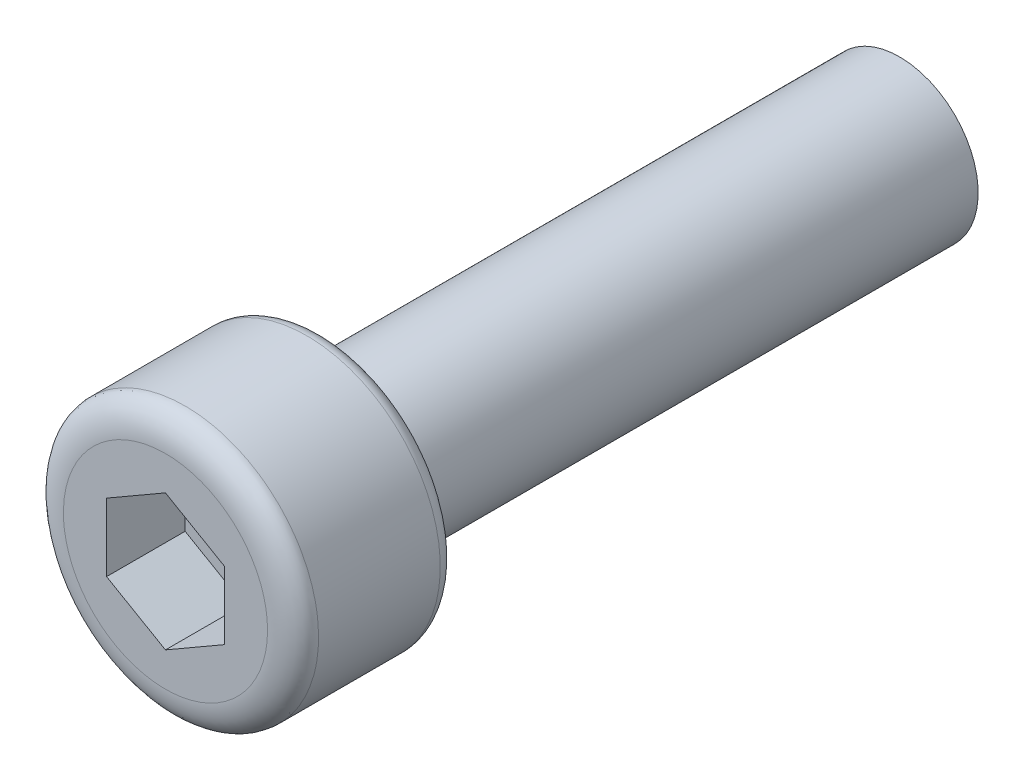
ISO-10303-21;
HEADER;
FILE_DESCRIPTION(('STEP AP214'),'2;1');
FILE_NAME('part.step','',(''),(''),'','','');
FILE_SCHEMA(('AUTOMOTIVE_DESIGN { 1 0 10303 214 1 1 1 1 }'));
ENDSEC;
DATA;
#1=APPLICATION_CONTEXT('core data for automotive mechanical design processes');
#2=APPLICATION_PROTOCOL_DEFINITION('international standard','automotive_design',2000,#1);
#3=PRODUCT_CONTEXT('',#1,'mechanical');
#4=PRODUCT('Part','Part','',(#3));
#5=PRODUCT_RELATED_PRODUCT_CATEGORY('part','',(#4));
#6=PRODUCT_DEFINITION_FORMATION('','',#4);
#7=PRODUCT_DEFINITION_CONTEXT('part definition',#1,'design');
#8=PRODUCT_DEFINITION('design','',#6,#7);
#9=PRODUCT_DEFINITION_SHAPE('','',#8);
#10=(LENGTH_UNIT() NAMED_UNIT(*) SI_UNIT(.MILLI.,.METRE.));
#11=(NAMED_UNIT(*) PLANE_ANGLE_UNIT() SI_UNIT($,.RADIAN.));
#12=(NAMED_UNIT(*) SI_UNIT($,.STERADIAN.) SOLID_ANGLE_UNIT());
#13=UNCERTAINTY_MEASURE_WITH_UNIT(LENGTH_MEASURE(1.E-05),#10,'distance_accuracy_value','');
#14=(GEOMETRIC_REPRESENTATION_CONTEXT(3) GLOBAL_UNCERTAINTY_ASSIGNED_CONTEXT((#13)) GLOBAL_UNIT_ASSIGNED_CONTEXT((#10,
#11,#12)) REPRESENTATION_CONTEXT('',''));
#15=CARTESIAN_POINT('',(0.,0.,0.));
#16=DIRECTION('',(0.,0.,1.));
#17=DIRECTION('',(1.,0.,0.));
#18=AXIS2_PLACEMENT_3D('',#15,#16,#17);
#19=CARTESIAN_POINT('',(0.,0.,9.5));
#20=DIRECTION('',(0.,0.,1.));
#21=DIRECTION('',(1.,0.,0.));
#22=AXIS2_PLACEMENT_3D('',#19,#20,#21);
#23=PLANE('',#22);
#24=DIRECTION('',(-0.866025403784439,0.5,0.));
#25=VECTOR('',#24,1.);
#26=CARTESIAN_POINT('',(1.5,0.86602540378444,9.5));
#27=LINE('',#26,#25);
#28=CARTESIAN_POINT('',(1.5,0.86602540378444,9.5));
#29=VERTEX_POINT('',#28);
#30=CARTESIAN_POINT('',(0.,1.73205080756888,9.5));
#31=VERTEX_POINT('',#30);
#32=EDGE_CURVE('E58',#29,#31,#27,.T.);
#33=ORIENTED_EDGE('',*,*,#32,.F.);
#34=DIRECTION('',(0.,1.,0.));
#35=VECTOR('',#34,1.);
#36=CARTESIAN_POINT('',(1.5,-0.866025403784439,9.5));
#37=LINE('',#36,#35);
#38=CARTESIAN_POINT('',(1.5,-0.866025403784439,9.5));
#39=VERTEX_POINT('',#38);
#40=EDGE_CURVE('E141',#39,#29,#37,.T.);
#41=ORIENTED_EDGE('',*,*,#40,.F.);
#42=DIRECTION('',(0.866025403784439,0.5,0.));
#43=VECTOR('',#42,1.);
#44=CARTESIAN_POINT('',(0.,-1.73205080756888,9.5));
#45=LINE('',#44,#43);
#46=CARTESIAN_POINT('',(0.,-1.73205080756888,9.5));
#47=VERTEX_POINT('',#46);
#48=EDGE_CURVE('E139',#47,#39,#45,.T.);
#49=ORIENTED_EDGE('',*,*,#48,.F.);
#50=DIRECTION('',(0.866025403784438,-0.5,0.));
#51=VECTOR('',#50,1.);
#52=CARTESIAN_POINT('',(-1.5,-0.866025403784438,9.5));
#53=LINE('',#52,#51);
#54=CARTESIAN_POINT('',(-1.5,-0.866025403784438,9.5));
#55=VERTEX_POINT('',#54);
#56=EDGE_CURVE('E106',#55,#47,#53,.T.);
#57=ORIENTED_EDGE('',*,*,#56,.F.);
#58=DIRECTION('',(0.,-1.,0.));
#59=VECTOR('',#58,1.);
#60=CARTESIAN_POINT('',(-1.5,0.866025403784439,9.5));
#61=LINE('',#60,#59);
#62=CARTESIAN_POINT('',(-1.5,0.866025403784439,9.5));
#63=VERTEX_POINT('',#62);
#64=EDGE_CURVE('E135',#63,#55,#61,.T.);
#65=ORIENTED_EDGE('',*,*,#64,.F.);
#66=DIRECTION('',(-0.866025403784439,-0.5,0.));
#67=VECTOR('',#66,1.);
#68=CARTESIAN_POINT('',(0.,1.73205080756888,9.5));
#69=LINE('',#68,#67);
#70=EDGE_CURVE('E132',#31,#63,#69,.T.);
#71=ORIENTED_EDGE('',*,*,#70,.F.);
#72=EDGE_LOOP('',(#33,#41,#49,#57,#65,#71));
#73=FACE_BOUND('',#72,.T.);
#74=CARTESIAN_POINT('',(-2.6,0.,9.5));
#75=CARTESIAN_POINT('',(-2.6,0.340339195747886,9.5));
#76=CARTESIAN_POINT('',(-2.53232895612653,0.680544507086418,9.5));
#77=CARTESIAN_POINT('',(-2.27184461293216,1.30940934121205,9.5));
#78=CARTESIAN_POINT('',(-2.07913378430198,1.59782147786811,9.5));
#79=CARTESIAN_POINT('',(-1.59782147786807,2.07913378430194,9.5));
#80=CARTESIAN_POINT('',(-1.30940934121205,2.27184461293216,9.5));
#81=CARTESIAN_POINT('',(-0.680544507086415,2.53232895612653,9.5));
#82=CARTESIAN_POINT('',(-0.340339195747888,2.6,9.5));
#83=CARTESIAN_POINT('',(0.340339195747889,2.6,9.5));
#84=CARTESIAN_POINT('',(0.680544507086413,2.53232895612653,9.5));
#85=CARTESIAN_POINT('',(1.30940934121205,2.27184461293216,9.5));
#86=CARTESIAN_POINT('',(1.59782147786806,2.07913378430191,9.5));
#87=CARTESIAN_POINT('',(2.07913378430199,1.59782147786813,9.5));
#88=CARTESIAN_POINT('',(2.27184461293214,1.30940934121206,9.5));
#89=CARTESIAN_POINT('',(2.53232895612655,0.680544507086403,9.5));
#90=CARTESIAN_POINT('',(2.6,0.340339195748112,9.5));
#91=CARTESIAN_POINT('',(2.6,-0.340339195748117,9.5));
#92=CARTESIAN_POINT('',(2.53232895612663,-0.680544507086149,9.5));
#93=CARTESIAN_POINT('',(2.27184461293207,-1.30940934121232,9.5));
#94=CARTESIAN_POINT('',(2.07913378430184,-1.59782147786829,9.5));
#95=CARTESIAN_POINT('',(1.59782147786821,-2.07913378430176,9.5));
#96=CARTESIAN_POINT('',(1.30940934121224,-2.27184461293209,9.5));
#97=CARTESIAN_POINT('',(0.68054450708623,-2.53232895612661,9.5));
#98=CARTESIAN_POINT('',(0.340339195748087,-2.6,9.5));
#99=CARTESIAN_POINT('',(-0.340339195748083,-2.6,9.5));
#100=CARTESIAN_POINT('',(-0.680544507086233,-2.53232895612661,9.5));
#101=CARTESIAN_POINT('',(-1.30940934121224,-2.27184461293209,9.5));
#102=CARTESIAN_POINT('',(-1.59782147786814,-2.07913378430198,9.5));
#103=CARTESIAN_POINT('',(-2.0791337843019,-1.59782147786808,9.5));
#104=CARTESIAN_POINT('',(-2.27184461293223,-1.30940934121205,9.5));
#105=CARTESIAN_POINT('',(-2.53232895612646,-0.680544507086416,9.5));
#106=CARTESIAN_POINT('',(-2.6,-0.34033919574789,9.5));
#107=CARTESIAN_POINT('',(-2.6,0.,9.5));
#108=(BOUNDED_CURVE() B_SPLINE_CURVE(3,(#74,#75,#76,#77,#78,#79,#80,#81,#82,#83,#84,#85,#86,#87,
#88,#89,#90,#91,#92,#93,#94,#95,#96,#97,#98,#99,#100,#101,#102,#103,#104,#105,#106,#107),
.UNSPECIFIED.,.T.,.F.) B_SPLINE_CURVE_WITH_KNOTS((4,2,2,2,2,2,2,2,2,2,2,2,2,2,2,2,4),
(-3.14159265358979,-2.74889357189107,-2.35619449019234,-1.96349540849362,-1.5707963267949,
-1.17809724509617,-0.785398163397448,-0.392699081698724,0.,0.392699081698724,0.785398163397448,
1.17809724509617,1.5707963267949,1.96349540849362,2.35619449019234,2.74889357189107,
3.14159265358979),
.UNSPECIFIED.) CURVE() GEOMETRIC_REPRESENTATION_ITEM() RATIONAL_B_SPLINE_CURVE((1.,1.,1.,1.,1.,
1.,1.,1.,1.,1.,1.,1.,1.,1.,1.,1.,1.,1.,1.,1.,1.,1.,1.,1.,1.,1.,1.,1.,1.,1.,1.,1.,1.,1.)) REPRESENTATION_ITEM(''));
#109=CARTESIAN_POINT('',(-2.6,0.,9.5));
#110=VERTEX_POINT('',#109);
#111=EDGE_CURVE('E12',#110,#110,#108,.F.);
#112=ORIENTED_EDGE('',*,*,#111,.T.);
#113=EDGE_LOOP('',(#112));
#114=FACE_BOUND('',#113,.T.);
#115=ADVANCED_FACE('F37',(#73,#114),#23,.T.);
#116=CARTESIAN_POINT('',(0.,0.,-9.5));
#117=DIRECTION('',(0.,0.,-1.));
#118=DIRECTION('',(-1.,0.,0.));
#119=AXIS2_PLACEMENT_3D('',#116,#117,#118);
#120=CYLINDRICAL_SURFACE('',#119,3.4);
#121=CARTESIAN_POINT('',(-3.4,0.,9.));
#122=CARTESIAN_POINT('',(-3.4,-0.445058948285702,9.));
#123=CARTESIAN_POINT('',(-3.31150709647312,-0.889942816959202,9.));
#124=CARTESIAN_POINT('',(-2.97087372460363,-1.7123045231234,9.));
#125=CARTESIAN_POINT('',(-2.71886725639482,-2.08945885567371,9.));
#126=CARTESIAN_POINT('',(-2.0894588556737,-2.71886725639483,9.));
#127=CARTESIAN_POINT('',(-1.71230452312369,-2.97087372460351,9.));
#128=CARTESIAN_POINT('',(-0.889942816958928,-3.31150709647324,9.));
#129=CARTESIAN_POINT('',(-0.445058948285955,-3.4,9.));
#130=CARTESIAN_POINT('',(0.445058948285959,-3.4,9.));
#131=CARTESIAN_POINT('',(0.889942816958924,-3.31150709647324,9.));
#132=CARTESIAN_POINT('',(1.71230452312369,-2.97087372460352,9.));
#133=CARTESIAN_POINT('',(2.08945885567385,-2.71886725639468,9.));
#134=CARTESIAN_POINT('',(2.71886725639468,-2.08945885567385,9.));
#135=CARTESIAN_POINT('',(2.97087372460348,-1.71230452312378,9.));
#136=CARTESIAN_POINT('',(3.31150709647328,-0.889942816958834,9.));
#137=CARTESIAN_POINT('',(3.4,-0.445058948285998,9.));
#138=CARTESIAN_POINT('',(3.4,0.445058948285993,9.));
#139=CARTESIAN_POINT('',(3.31150709647316,0.889942816959108,9.));
#140=CARTESIAN_POINT('',(2.97087372460359,1.7123045231235,9.));
#141=CARTESIAN_POINT('',(2.71886725639486,2.08945885567366,9.));
#142=CARTESIAN_POINT('',(2.08945885567366,2.71886725639486,9.));
#143=CARTESIAN_POINT('',(1.71230452312347,2.9708737246036,9.));
#144=CARTESIAN_POINT('',(0.889942816959137,3.31150709647315,9.));
#145=CARTESIAN_POINT('',(0.4450589482857,3.4,9.));
#146=CARTESIAN_POINT('',(-0.4450589482857,3.4,9.));
#147=CARTESIAN_POINT('',(-0.889942816959166,3.31150709647314,9.));
#148=CARTESIAN_POINT('',(-1.71230452312345,2.97087372460361,9.));
#149=CARTESIAN_POINT('',(-2.08945885567367,2.71886725639485,9.));
#150=CARTESIAN_POINT('',(-2.71886725639486,2.08945885567366,9.));
#151=CARTESIAN_POINT('',(-2.9708737246036,1.71230452312347,9.));
#152=CARTESIAN_POINT('',(-3.31150709647314,0.88994281695915,9.));
#153=CARTESIAN_POINT('',(-3.4,0.445058948285698,9.));
#154=CARTESIAN_POINT('',(-3.4,0.,9.));
#155=(BOUNDED_CURVE() B_SPLINE_CURVE(3,(#121,#122,#123,#124,#125,#126,#127,#128,#129,#130,#131,
#132,#133,#134,#135,#136,#137,#138,#139,#140,#141,#142,#143,#144,#145,#146,#147,#148,#149,#150,
#151,#152,#153,#154),.UNSPECIFIED.,.T.,.F.) B_SPLINE_CURVE_WITH_KNOTS((4,2,2,2,2,2,2,2,2,2,2,2,
2,2,2,2,4),(-3.14159265358979,-2.74889357189107,-2.35619449019234,-1.96349540849362,
-1.5707963267949,-1.17809724509617,-0.785398163397448,-0.392699081698724,0.,0.392699081698724,
0.785398163397448,1.17809724509617,1.5707963267949,1.96349540849362,2.35619449019234,
2.74889357189107,3.14159265358979),
.UNSPECIFIED.) CURVE() GEOMETRIC_REPRESENTATION_ITEM() RATIONAL_B_SPLINE_CURVE((1.,1.,1.,1.,1.,
1.,1.,1.,1.,1.,1.,1.,1.,1.,1.,1.,1.,1.,1.,1.,1.,1.,1.,1.,1.,1.,1.,1.,1.,1.,1.,1.,1.,1.)) REPRESENTATION_ITEM(''));
#156=CARTESIAN_POINT('',(-3.4,0.,9.));
#157=VERTEX_POINT('',#156);
#158=EDGE_CURVE('E51',#157,#157,#155,.F.);
#159=ORIENTED_EDGE('',*,*,#158,.T.);
#160=EDGE_LOOP('',(#159));
#161=FACE_BOUND('',#160,.T.);
#162=CARTESIAN_POINT('',(0.,0.,5.9));
#163=DIRECTION('',(0.,0.,-1.));
#164=DIRECTION('',(-1.,0.,0.));
#165=AXIS2_PLACEMENT_3D('',#162,#163,#164);
#166=CIRCLE('',#165,3.4);
#167=CARTESIAN_POINT('',(-3.4,0.,5.9));
#168=VERTEX_POINT('',#167);
#169=EDGE_CURVE('E162',#168,#168,#166,.F.);
#170=ORIENTED_EDGE('',*,*,#169,.T.);
#171=EDGE_LOOP('',(#170));
#172=FACE_BOUND('',#171,.T.);
#173=ADVANCED_FACE('F174',(#161,#172),#120,.T.);
#174=CARTESIAN_POINT('',(0.,3.4,5.5));
#175=DIRECTION('',(0.,0.,-1.));
#176=DIRECTION('',(-1.,0.,0.));
#177=AXIS2_PLACEMENT_3D('',#174,#175,#176);
#178=PLANE('',#177);
#179=CARTESIAN_POINT('',(0.,0.,5.5));
#180=DIRECTION('',(0.,0.,-1.));
#181=DIRECTION('',(-1.,0.,0.));
#182=AXIS2_PLACEMENT_3D('',#179,#180,#181);
#183=CIRCLE('',#182,3.);
#184=CARTESIAN_POINT('',(-3.,0.,5.5));
#185=VERTEX_POINT('',#184);
#186=EDGE_CURVE('E159',#185,#185,#183,.T.);
#187=ORIENTED_EDGE('',*,*,#186,.T.);
#188=EDGE_LOOP('',(#187));
#189=FACE_BOUND('',#188,.T.);
#190=CARTESIAN_POINT('',(0.,0.,5.5));
#191=DIRECTION('',(0.,0.,-1.));
#192=DIRECTION('',(-1.,0.,0.));
#193=AXIS2_PLACEMENT_3D('',#190,#191,#192);
#194=CIRCLE('',#193,2.);
#195=CARTESIAN_POINT('',(-2.,0.,5.5));
#196=VERTEX_POINT('',#195);
#197=EDGE_CURVE('E145',#196,#196,#194,.T.);
#198=ORIENTED_EDGE('',*,*,#197,.F.);
#199=EDGE_LOOP('',(#198));
#200=FACE_BOUND('',#199,.T.);
#201=ADVANCED_FACE('F184',(#189,#200),#178,.T.);
#202=CARTESIAN_POINT('',(0.,0.,-9.5));
#203=DIRECTION('',(0.,0.,-1.));
#204=DIRECTION('',(-1.,0.,0.));
#205=AXIS2_PLACEMENT_3D('',#202,#203,#204);
#206=CYLINDRICAL_SURFACE('',#205,2.);
#207=CARTESIAN_POINT('',(0.,0.,-9.2));
#208=DIRECTION('',(0.,0.,-1.));
#209=DIRECTION('',(-1.,0.,0.));
#210=AXIS2_PLACEMENT_3D('',#207,#208,#209);
#211=CIRCLE('',#210,2.);
#212=CARTESIAN_POINT('',(-2.,0.,-9.2));
#213=VERTEX_POINT('',#212);
#214=EDGE_CURVE('E156',#213,#213,#211,.F.);
#215=ORIENTED_EDGE('',*,*,#214,.T.);
#216=EDGE_LOOP('',(#215));
#217=FACE_BOUND('',#216,.T.);
#218=ORIENTED_EDGE('',*,*,#197,.T.);
#219=EDGE_LOOP('',(#218));
#220=FACE_BOUND('',#219,.T.);
#221=ADVANCED_FACE('F233',(#217,#220),#206,.T.);
#222=CARTESIAN_POINT('',(0.,2.,-9.5));
#223=DIRECTION('',(0.,0.,-1.));
#224=DIRECTION('',(-1.,0.,0.));
#225=AXIS2_PLACEMENT_3D('',#222,#223,#224);
#226=PLANE('',#225);
#227=CARTESIAN_POINT('',(0.,0.,-9.5));
#228=DIRECTION('',(0.,0.,-1.));
#229=DIRECTION('',(-1.,0.,0.));
#230=AXIS2_PLACEMENT_3D('',#227,#228,#229);
#231=CIRCLE('',#230,1.48038475772934);
#232=CARTESIAN_POINT('',(-1.48038475772934,0.,-9.5));
#233=VERTEX_POINT('',#232);
#234=EDGE_CURVE('E153',#233,#233,#231,.T.);
#235=ORIENTED_EDGE('',*,*,#234,.T.);
#236=EDGE_LOOP('',(#235));
#237=FACE_BOUND('',#236,.T.);
#238=ADVANCED_FACE('F225',(#237),#226,.T.);
#239=CARTESIAN_POINT('',(0.,0.,-9.5));
#240=DIRECTION('',(0.,0.,1.));
#241=DIRECTION('',(1.,0.,0.));
#242=AXIS2_PLACEMENT_3D('',#239,#240,#241);
#243=CONICAL_SURFACE('',#242,1.48038475772934,1.0471975511966);
#244=ORIENTED_EDGE('',*,*,#214,.F.);
#245=EDGE_LOOP('',(#244));
#246=FACE_BOUND('',#245,.T.);
#247=ORIENTED_EDGE('',*,*,#234,.F.);
#248=EDGE_LOOP('',(#247));
#249=FACE_BOUND('',#248,.T.);
#250=ADVANCED_FACE('F191',(#246,#249),#243,.T.);
#251=CARTESIAN_POINT('',(0.,0.,5.9));
#252=DIRECTION('',(0.,0.,-1.));
#253=DIRECTION('',(-1.,0.,0.));
#254=AXIS2_PLACEMENT_3D('',#251,#252,#253);
#255=TOROIDAL_SURFACE('',#254,3.,0.4);
#256=ORIENTED_EDGE('',*,*,#169,.F.);
#257=EDGE_LOOP('',(#256));
#258=FACE_BOUND('',#257,.T.);
#259=ORIENTED_EDGE('',*,*,#186,.F.);
#260=EDGE_LOOP('',(#259));
#261=FACE_BOUND('',#260,.T.);
#262=ADVANCED_FACE('F214',(#258,#261),#255,.T.);
#263=CARTESIAN_POINT('',(-2.6,0.,9.5));
#264=CARTESIAN_POINT('',(-2.6,-0.34033919574789,9.5));
#265=CARTESIAN_POINT('',(-2.53232895612646,-0.680544507086416,9.5));
#266=CARTESIAN_POINT('',(-2.27184461293223,-1.30940934121205,9.5));
#267=CARTESIAN_POINT('',(-2.0791337843019,-1.59782147786808,9.5));
#268=CARTESIAN_POINT('',(-1.59782147786814,-2.07913378430198,9.5));
#269=CARTESIAN_POINT('',(-1.30940934121224,-2.27184461293209,9.5));
#270=CARTESIAN_POINT('',(-0.680544507086233,-2.53232895612661,9.5));
#271=CARTESIAN_POINT('',(-0.340339195748083,-2.6,9.5));
#272=CARTESIAN_POINT('',(0.340339195748087,-2.6,9.5));
#273=CARTESIAN_POINT('',(0.68054450708623,-2.53232895612661,9.5));
#274=CARTESIAN_POINT('',(1.30940934121224,-2.27184461293209,9.5));
#275=CARTESIAN_POINT('',(1.59782147786821,-2.07913378430176,9.5));
#276=CARTESIAN_POINT('',(2.07913378430184,-1.59782147786829,9.5));
#277=CARTESIAN_POINT('',(2.27184461293207,-1.30940934121232,9.5));
#278=CARTESIAN_POINT('',(2.53232895612663,-0.680544507086149,9.5));
#279=CARTESIAN_POINT('',(2.6,-0.340339195748117,9.5));
#280=CARTESIAN_POINT('',(2.6,0.340339195748112,9.5));
#281=CARTESIAN_POINT('',(2.53232895612655,0.680544507086403,9.5));
#282=CARTESIAN_POINT('',(2.27184461293214,1.30940934121206,9.5));
#283=CARTESIAN_POINT('',(2.07913378430199,1.59782147786813,9.5));
#284=CARTESIAN_POINT('',(1.59782147786806,2.07913378430191,9.5));
#285=CARTESIAN_POINT('',(1.30940934121205,2.27184461293216,9.5));
#286=CARTESIAN_POINT('',(0.680544507086413,2.53232895612653,9.5));
#287=CARTESIAN_POINT('',(0.340339195747889,2.6,9.5));
#288=CARTESIAN_POINT('',(-0.340339195747888,2.6,9.5));
#289=CARTESIAN_POINT('',(-0.680544507086415,2.53232895612653,9.5));
#290=CARTESIAN_POINT('',(-1.30940934121205,2.27184461293216,9.5));
#291=CARTESIAN_POINT('',(-1.59782147786807,2.07913378430194,9.5));
#292=CARTESIAN_POINT('',(-2.07913378430198,1.59782147786811,9.5));
#293=CARTESIAN_POINT('',(-2.27184461293216,1.30940934121205,9.5));
#294=CARTESIAN_POINT('',(-2.53232895612653,0.680544507086418,9.5));
#295=CARTESIAN_POINT('',(-2.6,0.340339195747886,9.5));
#296=CARTESIAN_POINT('',(-2.6,0.,9.5));
#297=CARTESIAN_POINT('',(-3.4,0.,9.5));
#298=CARTESIAN_POINT('',(-3.4,-0.445058948285702,9.5));
#299=CARTESIAN_POINT('',(-3.31150709647311,-0.889942816959198,9.5));
#300=CARTESIAN_POINT('',(-2.97087372460364,-1.71230452312341,9.5));
#301=CARTESIAN_POINT('',(-2.71886725639478,-2.08945885567367,9.5));
#302=CARTESIAN_POINT('',(-2.08945885567374,-2.71886725639486,9.5));
#303=CARTESIAN_POINT('',(-1.7123045231237,-2.97087372460352,9.5));
#304=CARTESIAN_POINT('',(-0.889942816958926,-3.31150709647323,9.5));
#305=CARTESIAN_POINT('',(-0.445058948285955,-3.4,9.5));
#306=CARTESIAN_POINT('',(0.445058948285959,-3.4,9.5));
#307=CARTESIAN_POINT('',(0.889942816958922,-3.31150709647324,9.5));
#308=CARTESIAN_POINT('',(1.71230452312369,-2.97087372460352,9.5));
#309=CARTESIAN_POINT('',(2.08945885567385,-2.71886725639468,9.5));
#310=CARTESIAN_POINT('',(2.71886725639468,-2.08945885567385,9.5));
#311=CARTESIAN_POINT('',(2.9708737246035,-1.71230452312379,9.5));
#312=CARTESIAN_POINT('',(3.31150709647326,-0.889942816958827,9.5));
#313=CARTESIAN_POINT('',(3.4,-0.445058948285998,9.5));
#314=CARTESIAN_POINT('',(3.4,0.445058948285993,9.5));
#315=CARTESIAN_POINT('',(3.31150709647318,0.889942816959118,9.5));
#316=CARTESIAN_POINT('',(2.97087372460357,1.71230452312349,9.5));
#317=CARTESIAN_POINT('',(2.71886725639482,2.08945885567362,9.5));
#318=CARTESIAN_POINT('',(2.0894588556737,2.7188672563949,9.5));
#319=CARTESIAN_POINT('',(1.71230452312347,2.97087372460359,9.5));
#320=CARTESIAN_POINT('',(0.889942816959141,3.31150709647316,9.5));
#321=CARTESIAN_POINT('',(0.4450589482857,3.4,9.5));
#322=CARTESIAN_POINT('',(-0.4450589482857,3.4,9.5));
#323=CARTESIAN_POINT('',(-0.889942816959144,3.31150709647308,9.5));
#324=CARTESIAN_POINT('',(-1.71230452312347,2.97087372460366,9.5));
#325=CARTESIAN_POINT('',(-2.08945885567367,2.71886725639485,9.5));
#326=CARTESIAN_POINT('',(-2.71886725639486,2.08945885567366,9.5));
#327=CARTESIAN_POINT('',(-2.97087372460357,1.71230452312345,9.5));
#328=CARTESIAN_POINT('',(-3.31150709647318,0.889942816959166,9.5));
#329=CARTESIAN_POINT('',(-3.4,0.445058948285698,9.5));
#330=CARTESIAN_POINT('',(-3.4,0.,9.5));
#331=CARTESIAN_POINT('',(-3.4,0.,9.));
#332=CARTESIAN_POINT('',(-3.4,-0.445058948285702,9.));
#333=CARTESIAN_POINT('',(-3.31150709647312,-0.889942816959202,9.));
#334=CARTESIAN_POINT('',(-2.97087372460363,-1.7123045231234,9.));
#335=CARTESIAN_POINT('',(-2.71886725639482,-2.08945885567371,9.));
#336=CARTESIAN_POINT('',(-2.0894588556737,-2.71886725639483,9.));
#337=CARTESIAN_POINT('',(-1.71230452312369,-2.97087372460351,9.));
#338=CARTESIAN_POINT('',(-0.889942816958928,-3.31150709647324,9.));
#339=CARTESIAN_POINT('',(-0.445058948285955,-3.4,9.));
#340=CARTESIAN_POINT('',(0.445058948285959,-3.4,9.));
#341=CARTESIAN_POINT('',(0.889942816958924,-3.31150709647324,9.));
#342=CARTESIAN_POINT('',(1.71230452312369,-2.97087372460352,9.));
#343=CARTESIAN_POINT('',(2.08945885567385,-2.71886725639468,9.));
#344=CARTESIAN_POINT('',(2.71886725639468,-2.08945885567385,9.));
#345=CARTESIAN_POINT('',(2.97087372460348,-1.71230452312378,9.));
#346=CARTESIAN_POINT('',(3.31150709647328,-0.889942816958834,9.));
#347=CARTESIAN_POINT('',(3.4,-0.445058948285998,9.));
#348=CARTESIAN_POINT('',(3.4,0.445058948285993,9.));
#349=CARTESIAN_POINT('',(3.31150709647316,0.889942816959108,9.));
#350=CARTESIAN_POINT('',(2.97087372460359,1.7123045231235,9.));
#351=CARTESIAN_POINT('',(2.71886725639486,2.08945885567366,9.));
#352=CARTESIAN_POINT('',(2.08945885567366,2.71886725639486,9.));
#353=CARTESIAN_POINT('',(1.71230452312347,2.9708737246036,9.));
#354=CARTESIAN_POINT('',(0.889942816959137,3.31150709647315,9.));
#355=CARTESIAN_POINT('',(0.4450589482857,3.4,9.));
#356=CARTESIAN_POINT('',(-0.4450589482857,3.4,9.));
#357=CARTESIAN_POINT('',(-0.889942816959166,3.31150709647314,9.));
#358=CARTESIAN_POINT('',(-1.71230452312345,2.97087372460361,9.));
#359=CARTESIAN_POINT('',(-2.08945885567367,2.71886725639485,9.));
#360=CARTESIAN_POINT('',(-2.71886725639486,2.08945885567366,9.));
#361=CARTESIAN_POINT('',(-2.9708737246036,1.71230452312347,9.));
#362=CARTESIAN_POINT('',(-3.31150709647314,0.88994281695915,9.));
#363=CARTESIAN_POINT('',(-3.4,0.445058948285698,9.));
#364=CARTESIAN_POINT('',(-3.4,0.,9.));
#365=(BOUNDED_SURFACE() B_SPLINE_SURFACE(2,3,((#263,#264,#265,#266,#267,#268,#269,#270,#271,
#272,#273,#274,#275,#276,#277,#278,#279,#280,#281,#282,#283,#284,#285,#286,#287,#288,#289,#290,
#291,#292,#293,#294,#295,#296),(#297,#298,#299,#300,#301,#302,#303,#304,#305,#306,#307,#308,
#309,#310,#311,#312,#313,#314,#315,#316,#317,#318,#319,#320,#321,#322,#323,#324,#325,#326,#327,
#328,#329,#330),(#331,#332,#333,#334,#335,#336,#337,#338,#339,#340,#341,#342,#343,#344,#345,
#346,#347,#348,#349,#350,#351,#352,#353,#354,#355,#356,#357,#358,#359,#360,#361,#362,#363,
#364)),.UNSPECIFIED.,.F.,.T.,.F.) B_SPLINE_SURFACE_WITH_KNOTS((3,3),(4,2,2,2,2,2,2,2,2,2,2,2,2,
2,2,2,4),(0.,1.),(-3.14159265358979,-2.74889357189107,-2.35619449019234,-1.96349540849362,
-1.5707963267949,-1.17809724509617,-0.785398163397448,-0.392699081698724,0.,0.392699081698724,
0.785398163397448,1.17809724509617,1.5707963267949,1.96349540849362,2.35619449019234,
2.74889357189107,3.14159265358979),
.UNSPECIFIED.) GEOMETRIC_REPRESENTATION_ITEM() RATIONAL_B_SPLINE_SURFACE(((1.,1.,1.,1.,1.,1.,1.,
1.,1.,1.,1.,1.,1.,1.,1.,1.,1.,1.,1.,1.,1.,1.,1.,1.,1.,1.,1.,1.,1.,1.,1.,1.,1.,1.),
(0.707106781186548,0.707106781186548,0.707106781186548,0.707106781186548,0.707106781186547,
0.707106781186547,0.707106781186548,0.707106781186548,0.707106781186548,0.707106781186548,
0.707106781186548,0.707106781186548,0.707106781186548,0.707106781186548,0.707106781186548,
0.707106781186548,0.707106781186548,0.707106781186548,0.707106781186548,0.707106781186548,
0.707106781186548,0.707106781186548,0.707106781186548,0.707106781186548,0.707106781186548,
0.707106781186548,0.707106781186548,0.707106781186548,0.707106781186548,0.707106781186548,
0.707106781186548,0.707106781186548,0.707106781186548,0.707106781186548),(1.,1.,1.,1.,1.,1.,1.,
1.,1.,1.,1.,1.,1.,1.,1.,1.,1.,1.,1.,1.,1.,1.,1.,1.,1.,1.,1.,1.,1.,1.,1.,1.,1.,1.))) REPRESENTATION_ITEM('') SURFACE());
#366=ORIENTED_EDGE('',*,*,#111,.F.);
#367=EDGE_LOOP('',(#366));
#368=FACE_BOUND('',#367,.T.);
#369=ORIENTED_EDGE('',*,*,#158,.F.);
#370=EDGE_LOOP('',(#369));
#371=FACE_BOUND('',#370,.T.);
#372=ADVANCED_FACE('F40',(#368,#371),#365,.T.);
#373=CARTESIAN_POINT('',(1.5,0.86602540378444,7.5));
#374=DIRECTION('',(0.5,0.866025403784439,0.));
#375=DIRECTION('',(-0.866025403784439,0.5,0.));
#376=AXIS2_PLACEMENT_3D('',#373,#374,#375);
#377=PLANE('',#376);
#378=ORIENTED_EDGE('',*,*,#32,.T.);
#379=DIRECTION('',(0.,0.,1.));
#380=VECTOR('',#379,1.);
#381=CARTESIAN_POINT('',(0.,1.73205080756888,7.5));
#382=LINE('',#381,#380);
#383=CARTESIAN_POINT('',(0.,1.73205080756888,7.5));
#384=VERTEX_POINT('',#383);
#385=EDGE_CURVE('E88',#384,#31,#382,.T.);
#386=ORIENTED_EDGE('',*,*,#385,.F.);
#387=DIRECTION('',(-0.866025403784439,0.5,0.));
#388=VECTOR('',#387,1.);
#389=CARTESIAN_POINT('',(1.5,0.86602540378444,7.5));
#390=LINE('',#389,#388);
#391=CARTESIAN_POINT('',(1.5,0.86602540378444,7.5));
#392=VERTEX_POINT('',#391);
#393=EDGE_CURVE('E143',#392,#384,#390,.T.);
#394=ORIENTED_EDGE('',*,*,#393,.F.);
#395=DIRECTION('',(0.,0.,1.));
#396=VECTOR('',#395,1.);
#397=CARTESIAN_POINT('',(1.5,0.86602540378444,7.5));
#398=LINE('',#397,#396);
#399=EDGE_CURVE('E66',#392,#29,#398,.T.);
#400=ORIENTED_EDGE('',*,*,#399,.T.);
#401=EDGE_LOOP('',(#378,#386,#394,#400));
#402=FACE_BOUND('',#401,.T.);
#403=ADVANCED_FACE('F213',(#402),#377,.F.);
#404=CARTESIAN_POINT('',(1.5,-0.866025403784439,7.5));
#405=DIRECTION('',(1.,0.,0.));
#406=DIRECTION('',(0.,0.,-1.));
#407=AXIS2_PLACEMENT_3D('',#404,#405,#406);
#408=PLANE('',#407);
#409=ORIENTED_EDGE('',*,*,#40,.T.);
#410=ORIENTED_EDGE('',*,*,#399,.F.);
#411=DIRECTION('',(0.,1.,0.));
#412=VECTOR('',#411,1.);
#413=CARTESIAN_POINT('',(1.5,-0.866025403784439,7.5));
#414=LINE('',#413,#412);
#415=CARTESIAN_POINT('',(1.5,-0.866025403784439,7.5));
#416=VERTEX_POINT('',#415);
#417=EDGE_CURVE('E118',#416,#392,#414,.T.);
#418=ORIENTED_EDGE('',*,*,#417,.F.);
#419=DIRECTION('',(0.,0.,1.));
#420=VECTOR('',#419,1.);
#421=CARTESIAN_POINT('',(1.5,-0.866025403784439,7.5));
#422=LINE('',#421,#420);
#423=EDGE_CURVE('E110',#416,#39,#422,.T.);
#424=ORIENTED_EDGE('',*,*,#423,.T.);
#425=EDGE_LOOP('',(#409,#410,#418,#424));
#426=FACE_BOUND('',#425,.T.);
#427=ADVANCED_FACE('F219',(#426),#408,.F.);
#428=CARTESIAN_POINT('',(0.,-1.73205080756888,7.5));
#429=DIRECTION('',(0.5,-0.866025403784439,0.));
#430=DIRECTION('',(0.866025403784439,0.5,0.));
#431=AXIS2_PLACEMENT_3D('',#428,#429,#430);
#432=PLANE('',#431);
#433=ORIENTED_EDGE('',*,*,#48,.T.);
#434=ORIENTED_EDGE('',*,*,#423,.F.);
#435=DIRECTION('',(0.866025403784439,0.5,0.));
#436=VECTOR('',#435,1.);
#437=CARTESIAN_POINT('',(0.,-1.73205080756888,7.5));
#438=LINE('',#437,#436);
#439=CARTESIAN_POINT('',(0.,-1.73205080756888,7.5));
#440=VERTEX_POINT('',#439);
#441=EDGE_CURVE('E114',#440,#416,#438,.T.);
#442=ORIENTED_EDGE('',*,*,#441,.F.);
#443=DIRECTION('',(0.,0.,1.));
#444=VECTOR('',#443,1.);
#445=CARTESIAN_POINT('',(0.,-1.73205080756888,7.5));
#446=LINE('',#445,#444);
#447=EDGE_CURVE('E99',#440,#47,#446,.T.);
#448=ORIENTED_EDGE('',*,*,#447,.T.);
#449=EDGE_LOOP('',(#433,#434,#442,#448));
#450=FACE_BOUND('',#449,.T.);
#451=ADVANCED_FACE('F115',(#450),#432,.F.);
#452=CARTESIAN_POINT('',(-1.5,-0.866025403784438,7.5));
#453=DIRECTION('',(-0.5,-0.866025403784439,0.));
#454=DIRECTION('',(0.866025403784439,-0.5,0.));
#455=AXIS2_PLACEMENT_3D('',#452,#453,#454);
#456=PLANE('',#455);
#457=ORIENTED_EDGE('',*,*,#56,.T.);
#458=ORIENTED_EDGE('',*,*,#447,.F.);
#459=DIRECTION('',(0.866025403784438,-0.5,0.));
#460=VECTOR('',#459,1.);
#461=CARTESIAN_POINT('',(-1.5,-0.866025403784438,7.5));
#462=LINE('',#461,#460);
#463=CARTESIAN_POINT('',(-1.5,-0.866025403784438,7.5));
#464=VERTEX_POINT('',#463);
#465=EDGE_CURVE('E103',#464,#440,#462,.T.);
#466=ORIENTED_EDGE('',*,*,#465,.F.);
#467=DIRECTION('',(0.,0.,1.));
#468=VECTOR('',#467,1.);
#469=CARTESIAN_POINT('',(-1.5,-0.866025403784438,7.5));
#470=LINE('',#469,#468);
#471=EDGE_CURVE('E111',#464,#55,#470,.T.);
#472=ORIENTED_EDGE('',*,*,#471,.T.);
#473=EDGE_LOOP('',(#457,#458,#466,#472));
#474=FACE_BOUND('',#473,.T.);
#475=ADVANCED_FACE('F101',(#474),#456,.F.);
#476=CARTESIAN_POINT('',(-1.5,0.866025403784439,7.5));
#477=DIRECTION('',(-1.,0.,0.));
#478=DIRECTION('',(0.,0.,1.));
#479=AXIS2_PLACEMENT_3D('',#476,#477,#478);
#480=PLANE('',#479);
#481=ORIENTED_EDGE('',*,*,#64,.T.);
#482=ORIENTED_EDGE('',*,*,#471,.F.);
#483=DIRECTION('',(0.,-1.,0.));
#484=VECTOR('',#483,1.);
#485=CARTESIAN_POINT('',(-1.5,0.866025403784439,7.5));
#486=LINE('',#485,#484);
#487=CARTESIAN_POINT('',(-1.5,0.866025403784439,7.5));
#488=VERTEX_POINT('',#487);
#489=EDGE_CURVE('E124',#488,#464,#486,.T.);
#490=ORIENTED_EDGE('',*,*,#489,.F.);
#491=DIRECTION('',(0.,0.,1.));
#492=VECTOR('',#491,1.);
#493=CARTESIAN_POINT('',(-1.5,0.866025403784439,7.5));
#494=LINE('',#493,#492);
#495=EDGE_CURVE('E148',#488,#63,#494,.T.);
#496=ORIENTED_EDGE('',*,*,#495,.T.);
#497=EDGE_LOOP('',(#481,#482,#490,#496));
#498=FACE_BOUND('',#497,.T.);
#499=ADVANCED_FACE('F247',(#498),#480,.F.);
#500=CARTESIAN_POINT('',(0.,1.73205080756888,7.5));
#501=DIRECTION('',(-0.5,0.866025403784439,0.));
#502=DIRECTION('',(-0.866025403784439,-0.5,0.));
#503=AXIS2_PLACEMENT_3D('',#500,#501,#502);
#504=PLANE('',#503);
#505=ORIENTED_EDGE('',*,*,#70,.T.);
#506=ORIENTED_EDGE('',*,*,#495,.F.);
#507=DIRECTION('',(-0.866025403784439,-0.5,0.));
#508=VECTOR('',#507,1.);
#509=CARTESIAN_POINT('',(0.,1.73205080756888,7.5));
#510=LINE('',#509,#508);
#511=EDGE_CURVE('E126',#384,#488,#510,.T.);
#512=ORIENTED_EDGE('',*,*,#511,.F.);
#513=ORIENTED_EDGE('',*,*,#385,.T.);
#514=EDGE_LOOP('',(#505,#506,#512,#513));
#515=FACE_BOUND('',#514,.T.);
#516=ADVANCED_FACE('F244',(#515),#504,.F.);
#517=CARTESIAN_POINT('',(0.,0.,7.5));
#518=DIRECTION('',(0.,0.,1.));
#519=DIRECTION('',(1.,0.,0.));
#520=AXIS2_PLACEMENT_3D('',#517,#518,#519);
#521=PLANE('',#520);
#522=ORIENTED_EDGE('',*,*,#393,.T.);
#523=ORIENTED_EDGE('',*,*,#511,.T.);
#524=ORIENTED_EDGE('',*,*,#489,.T.);
#525=ORIENTED_EDGE('',*,*,#465,.T.);
#526=ORIENTED_EDGE('',*,*,#441,.T.);
#527=ORIENTED_EDGE('',*,*,#417,.T.);
#528=EDGE_LOOP('',(#522,#523,#524,#525,#526,#527));
#529=FACE_BOUND('',#528,.T.);
#530=ADVANCED_FACE('F121',(#529),#521,.T.);
#531=CLOSED_SHELL('',(#115,#173,#201,#221,#238,#250,#262,#372,#403,#427,#451,#475,#499,#516,#530));
#532=MANIFOLD_SOLID_BREP('B2',#531);
#533=ADVANCED_BREP_SHAPE_REPRESENTATION('',(#18,#532),#14);
#534=SHAPE_DEFINITION_REPRESENTATION(#9,#533);
ENDSEC;
END-ISO-10303-21;
